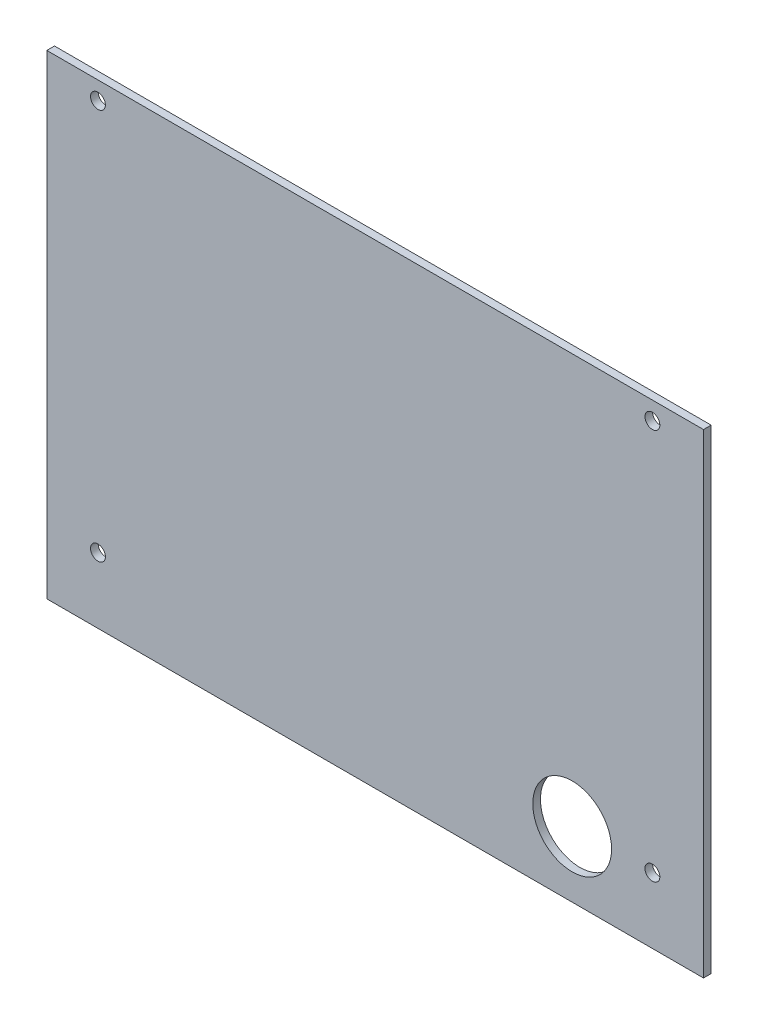
ISO-10303-21;
HEADER;
FILE_DESCRIPTION(('STEP AP214'),'2;1');
FILE_NAME('part.step','',(''),(''),'','','');
FILE_SCHEMA(('AUTOMOTIVE_DESIGN { 1 0 10303 214 1 1 1 1 }'));
ENDSEC;
DATA;
#1=APPLICATION_CONTEXT('core data for automotive mechanical design processes');
#2=APPLICATION_PROTOCOL_DEFINITION('international standard','automotive_design',2000,#1);
#3=PRODUCT_CONTEXT('',#1,'mechanical');
#4=PRODUCT('Part','Part','',(#3));
#5=PRODUCT_RELATED_PRODUCT_CATEGORY('part','',(#4));
#6=PRODUCT_DEFINITION_FORMATION('','',#4);
#7=PRODUCT_DEFINITION_CONTEXT('part definition',#1,'design');
#8=PRODUCT_DEFINITION('design','',#6,#7);
#9=PRODUCT_DEFINITION_SHAPE('','',#8);
#10=(LENGTH_UNIT() NAMED_UNIT(*) SI_UNIT(.MILLI.,.METRE.));
#11=(NAMED_UNIT(*) PLANE_ANGLE_UNIT() SI_UNIT($,.RADIAN.));
#12=(NAMED_UNIT(*) SI_UNIT($,.STERADIAN.) SOLID_ANGLE_UNIT());
#13=UNCERTAINTY_MEASURE_WITH_UNIT(LENGTH_MEASURE(1.E-05),#10,'distance_accuracy_value','');
#14=(GEOMETRIC_REPRESENTATION_CONTEXT(3) GLOBAL_UNCERTAINTY_ASSIGNED_CONTEXT((#13)) GLOBAL_UNIT_ASSIGNED_CONTEXT((#10,
#11,#12)) REPRESENTATION_CONTEXT('',''));
#15=CARTESIAN_POINT('',(0.,0.,0.));
#16=DIRECTION('',(0.,0.,1.));
#17=DIRECTION('',(1.,0.,0.));
#18=AXIS2_PLACEMENT_3D('',#15,#16,#17);
#19=CARTESIAN_POINT('',(75.,101.774140149894,-1.75));
#20=DIRECTION('',(1.,0.,0.));
#21=DIRECTION('',(0.,1.,0.));
#22=AXIS2_PLACEMENT_3D('',#19,#20,#21);
#23=PLANE('',#22);
#24=DIRECTION('',(0.,1.,0.));
#25=VECTOR('',#24,1.);
#26=CARTESIAN_POINT('',(75.,101.774140149894,0.));
#27=LINE('',#26,#25);
#28=CARTESIAN_POINT('',(75.,-6.72585985010618,0.));
#29=VERTEX_POINT('',#28);
#30=CARTESIAN_POINT('',(75.,101.774140149894,0.));
#31=VERTEX_POINT('',#30);
#32=EDGE_CURVE('E104',#29,#31,#27,.T.);
#33=ORIENTED_EDGE('',*,*,#32,.F.);
#34=DIRECTION('',(0.,0.,1.));
#35=VECTOR('',#34,1.);
#36=CARTESIAN_POINT('',(75.,-6.72585985010618,-1.75));
#37=LINE('',#36,#35);
#38=CARTESIAN_POINT('',(75.,-6.72585985010618,-1.75));
#39=VERTEX_POINT('',#38);
#40=EDGE_CURVE('E11',#39,#29,#37,.T.);
#41=ORIENTED_EDGE('',*,*,#40,.F.);
#42=DIRECTION('',(0.,1.,0.));
#43=VECTOR('',#42,1.);
#44=CARTESIAN_POINT('',(75.,101.774140149894,-1.75));
#45=LINE('',#44,#43);
#46=CARTESIAN_POINT('',(75.,101.774140149894,-1.75));
#47=VERTEX_POINT('',#46);
#48=EDGE_CURVE('E97',#39,#47,#45,.T.);
#49=ORIENTED_EDGE('',*,*,#48,.T.);
#50=DIRECTION('',(0.,0.,1.));
#51=VECTOR('',#50,1.);
#52=CARTESIAN_POINT('',(75.,101.774140149894,-1.75));
#53=LINE('',#52,#51);
#54=EDGE_CURVE('E42',#47,#31,#53,.T.);
#55=ORIENTED_EDGE('',*,*,#54,.T.);
#56=EDGE_LOOP('',(#33,#41,#49,#55));
#57=FACE_BOUND('',#56,.T.);
#58=ADVANCED_FACE('F39',(#57),#23,.T.);
#59=CARTESIAN_POINT('',(-75.,-6.72585985010618,-1.75));
#60=DIRECTION('',(0.,-1.,0.));
#61=DIRECTION('',(0.,0.,-1.));
#62=AXIS2_PLACEMENT_3D('',#59,#60,#61);
#63=PLANE('',#62);
#64=DIRECTION('',(1.,0.,0.));
#65=VECTOR('',#64,1.);
#66=CARTESIAN_POINT('',(-75.,-6.72585985010618,0.));
#67=LINE('',#66,#65);
#68=CARTESIAN_POINT('',(-75.,-6.72585985010618,0.));
#69=VERTEX_POINT('',#68);
#70=EDGE_CURVE('E99',#69,#29,#67,.T.);
#71=ORIENTED_EDGE('',*,*,#70,.F.);
#72=DIRECTION('',(0.,0.,1.));
#73=VECTOR('',#72,1.);
#74=CARTESIAN_POINT('',(-75.,-6.72585985010618,-1.75));
#75=LINE('',#74,#73);
#76=CARTESIAN_POINT('',(-75.,-6.72585985010618,-1.75));
#77=VERTEX_POINT('',#76);
#78=EDGE_CURVE('E48',#77,#69,#75,.T.);
#79=ORIENTED_EDGE('',*,*,#78,.F.);
#80=DIRECTION('',(1.,0.,0.));
#81=VECTOR('',#80,1.);
#82=CARTESIAN_POINT('',(-75.,-6.72585985010618,-1.75));
#83=LINE('',#82,#81);
#84=EDGE_CURVE('E94',#77,#39,#83,.T.);
#85=ORIENTED_EDGE('',*,*,#84,.T.);
#86=ORIENTED_EDGE('',*,*,#40,.T.);
#87=EDGE_LOOP('',(#71,#79,#85,#86));
#88=FACE_BOUND('',#87,.T.);
#89=ADVANCED_FACE('F115',(#88),#63,.T.);
#90=CARTESIAN_POINT('',(-75.,101.774140149894,-1.75));
#91=DIRECTION('',(-1.,0.,0.));
#92=DIRECTION('',(0.,-1.,0.));
#93=AXIS2_PLACEMENT_3D('',#90,#91,#92);
#94=PLANE('',#93);
#95=DIRECTION('',(0.,-1.,0.));
#96=VECTOR('',#95,1.);
#97=CARTESIAN_POINT('',(-75.,101.774140149894,0.));
#98=LINE('',#97,#96);
#99=CARTESIAN_POINT('',(-75.,101.774140149894,0.));
#100=VERTEX_POINT('',#99);
#101=EDGE_CURVE('E89',#100,#69,#98,.T.);
#102=ORIENTED_EDGE('',*,*,#101,.F.);
#103=DIRECTION('',(0.,0.,1.));
#104=VECTOR('',#103,1.);
#105=CARTESIAN_POINT('',(-75.,101.774140149894,-1.75));
#106=LINE('',#105,#104);
#107=CARTESIAN_POINT('',(-75.,101.774140149894,-1.75));
#108=VERTEX_POINT('',#107);
#109=EDGE_CURVE('E84',#108,#100,#106,.T.);
#110=ORIENTED_EDGE('',*,*,#109,.F.);
#111=DIRECTION('',(0.,-1.,0.));
#112=VECTOR('',#111,1.);
#113=CARTESIAN_POINT('',(-75.,101.774140149894,-1.75));
#114=LINE('',#113,#112);
#115=EDGE_CURVE('E87',#108,#77,#114,.T.);
#116=ORIENTED_EDGE('',*,*,#115,.T.);
#117=ORIENTED_EDGE('',*,*,#78,.T.);
#118=EDGE_LOOP('',(#102,#110,#116,#117));
#119=FACE_BOUND('',#118,.T.);
#120=ADVANCED_FACE('F86',(#119),#94,.T.);
#121=CARTESIAN_POINT('',(-75.,101.774140149894,-1.75));
#122=DIRECTION('',(0.,1.,0.));
#123=DIRECTION('',(0.,0.,1.));
#124=AXIS2_PLACEMENT_3D('',#121,#122,#123);
#125=PLANE('',#124);
#126=DIRECTION('',(-1.,0.,0.));
#127=VECTOR('',#126,1.);
#128=CARTESIAN_POINT('',(-75.,101.774140149894,0.));
#129=LINE('',#128,#127);
#130=EDGE_CURVE('E107',#31,#100,#129,.T.);
#131=ORIENTED_EDGE('',*,*,#130,.F.);
#132=ORIENTED_EDGE('',*,*,#54,.F.);
#133=DIRECTION('',(-1.,0.,0.));
#134=VECTOR('',#133,1.);
#135=CARTESIAN_POINT('',(-75.,101.774140149894,-1.75));
#136=LINE('',#135,#134);
#137=EDGE_CURVE('E93',#47,#108,#136,.T.);
#138=ORIENTED_EDGE('',*,*,#137,.T.);
#139=ORIENTED_EDGE('',*,*,#109,.T.);
#140=EDGE_LOOP('',(#131,#132,#138,#139));
#141=FACE_BOUND('',#140,.T.);
#142=ADVANCED_FACE('F96',(#141),#125,.T.);
#143=CARTESIAN_POINT('',(0.,0.,-1.75));
#144=DIRECTION('',(0.,0.,1.));
#145=DIRECTION('',(1.,0.,0.));
#146=AXIS2_PLACEMENT_3D('',#143,#144,#145);
#147=PLANE('',#146);
#148=CARTESIAN_POINT('',(-63.325,8.27414014989382,-1.75));
#149=DIRECTION('',(0.,0.,1.));
#150=DIRECTION('',(1.,0.,0.));
#151=AXIS2_PLACEMENT_3D('',#148,#149,#150);
#152=CIRCLE('',#151,1.7);
#153=CARTESIAN_POINT('',(-61.625,8.27414014989382,-1.75));
#154=VERTEX_POINT('',#153);
#155=EDGE_CURVE('E160',#154,#154,#152,.T.);
#156=ORIENTED_EDGE('',*,*,#155,.T.);
#157=EDGE_LOOP('',(#156));
#158=FACE_BOUND('',#157,.T.);
#159=CARTESIAN_POINT('',(-63.325,97.6491401498941,-1.75));
#160=DIRECTION('',(0.,0.,1.));
#161=DIRECTION('',(1.,0.,0.));
#162=AXIS2_PLACEMENT_3D('',#159,#160,#161);
#163=CIRCLE('',#162,1.7);
#164=CARTESIAN_POINT('',(-61.625,97.6491401498941,-1.75));
#165=VERTEX_POINT('',#164);
#166=EDGE_CURVE('E170',#165,#165,#163,.T.);
#167=ORIENTED_EDGE('',*,*,#166,.T.);
#168=EDGE_LOOP('',(#167));
#169=FACE_BOUND('',#168,.T.);
#170=CARTESIAN_POINT('',(63.325,8.27414014989382,-1.75));
#171=DIRECTION('',(0.,0.,1.));
#172=DIRECTION('',(1.,0.,0.));
#173=AXIS2_PLACEMENT_3D('',#170,#171,#172);
#174=CIRCLE('',#173,1.69999999999999);
#175=CARTESIAN_POINT('',(65.025,8.27414014989382,-1.75));
#176=VERTEX_POINT('',#175);
#177=EDGE_CURVE('E176',#176,#176,#174,.T.);
#178=ORIENTED_EDGE('',*,*,#177,.T.);
#179=EDGE_LOOP('',(#178));
#180=FACE_BOUND('',#179,.T.);
#181=CARTESIAN_POINT('',(63.325,97.6491401498941,-1.75));
#182=DIRECTION('',(0.,0.,1.));
#183=DIRECTION('',(1.,0.,0.));
#184=AXIS2_PLACEMENT_3D('',#181,#182,#183);
#185=CIRCLE('',#184,1.69999999999999);
#186=CARTESIAN_POINT('',(65.025,97.6491401498941,-1.75));
#187=VERTEX_POINT('',#186);
#188=EDGE_CURVE('E182',#187,#187,#185,.T.);
#189=ORIENTED_EDGE('',*,*,#188,.T.);
#190=EDGE_LOOP('',(#189));
#191=FACE_BOUND('',#190,.T.);
#192=CARTESIAN_POINT('',(45.,8.27414014989382,-1.75));
#193=DIRECTION('',(0.,0.,1.));
#194=DIRECTION('',(1.,0.,0.));
#195=AXIS2_PLACEMENT_3D('',#192,#193,#194);
#196=CIRCLE('',#195,8.999999999999);
#197=CARTESIAN_POINT('',(53.999999999999,8.27414014989382,-1.75));
#198=VERTEX_POINT('',#197);
#199=EDGE_CURVE('E108',#198,#198,#196,.F.);
#200=ORIENTED_EDGE('',*,*,#199,.F.);
#201=EDGE_LOOP('',(#200));
#202=FACE_BOUND('',#201,.T.);
#203=ORIENTED_EDGE('',*,*,#48,.F.);
#204=ORIENTED_EDGE('',*,*,#84,.F.);
#205=ORIENTED_EDGE('',*,*,#115,.F.);
#206=ORIENTED_EDGE('',*,*,#137,.F.);
#207=EDGE_LOOP('',(#203,#204,#205,#206));
#208=FACE_BOUND('',#207,.T.);
#209=ADVANCED_FACE('F92',(#158,#169,#180,#191,#202,#208),#147,.F.);
#210=CARTESIAN_POINT('',(0.,0.,0.));
#211=DIRECTION('',(0.,0.,1.));
#212=DIRECTION('',(1.,0.,0.));
#213=AXIS2_PLACEMENT_3D('',#210,#211,#212);
#214=PLANE('',#213);
#215=CARTESIAN_POINT('',(-63.325,8.27414014989382,0.));
#216=DIRECTION('',(0.,0.,1.));
#217=DIRECTION('',(1.,0.,0.));
#218=AXIS2_PLACEMENT_3D('',#215,#216,#217);
#219=CIRCLE('',#218,1.7);
#220=CARTESIAN_POINT('',(-61.625,8.27414014989382,0.));
#221=VERTEX_POINT('',#220);
#222=EDGE_CURVE('E163',#221,#221,#219,.T.);
#223=ORIENTED_EDGE('',*,*,#222,.F.);
#224=EDGE_LOOP('',(#223));
#225=FACE_BOUND('',#224,.T.);
#226=CARTESIAN_POINT('',(-63.325,97.6491401498941,0.));
#227=DIRECTION('',(0.,0.,1.));
#228=DIRECTION('',(1.,0.,0.));
#229=AXIS2_PLACEMENT_3D('',#226,#227,#228);
#230=CIRCLE('',#229,1.7);
#231=CARTESIAN_POINT('',(-61.625,97.6491401498941,0.));
#232=VERTEX_POINT('',#231);
#233=EDGE_CURVE('E165',#232,#232,#230,.T.);
#234=ORIENTED_EDGE('',*,*,#233,.F.);
#235=EDGE_LOOP('',(#234));
#236=FACE_BOUND('',#235,.T.);
#237=CARTESIAN_POINT('',(63.325,8.27414014989382,0.));
#238=DIRECTION('',(0.,0.,1.));
#239=DIRECTION('',(1.,0.,0.));
#240=AXIS2_PLACEMENT_3D('',#237,#238,#239);
#241=CIRCLE('',#240,1.69999999999999);
#242=CARTESIAN_POINT('',(65.025,8.27414014989382,0.));
#243=VERTEX_POINT('',#242);
#244=EDGE_CURVE('E173',#243,#243,#241,.T.);
#245=ORIENTED_EDGE('',*,*,#244,.F.);
#246=EDGE_LOOP('',(#245));
#247=FACE_BOUND('',#246,.T.);
#248=CARTESIAN_POINT('',(63.325,97.6491401498941,0.));
#249=DIRECTION('',(0.,0.,1.));
#250=DIRECTION('',(1.,0.,0.));
#251=AXIS2_PLACEMENT_3D('',#248,#249,#250);
#252=CIRCLE('',#251,1.69999999999999);
#253=CARTESIAN_POINT('',(65.025,97.6491401498941,0.));
#254=VERTEX_POINT('',#253);
#255=EDGE_CURVE('E179',#254,#254,#252,.T.);
#256=ORIENTED_EDGE('',*,*,#255,.F.);
#257=EDGE_LOOP('',(#256));
#258=FACE_BOUND('',#257,.T.);
#259=CARTESIAN_POINT('',(45.,8.27414014989382,0.));
#260=DIRECTION('',(0.,0.,1.));
#261=DIRECTION('',(1.,0.,0.));
#262=AXIS2_PLACEMENT_3D('',#259,#260,#261);
#263=CIRCLE('',#262,8.999999999999);
#264=CARTESIAN_POINT('',(53.999999999999,8.27414014989382,0.));
#265=VERTEX_POINT('',#264);
#266=EDGE_CURVE('E185',#265,#265,#263,.T.);
#267=ORIENTED_EDGE('',*,*,#266,.F.);
#268=EDGE_LOOP('',(#267));
#269=FACE_BOUND('',#268,.T.);
#270=ORIENTED_EDGE('',*,*,#32,.T.);
#271=ORIENTED_EDGE('',*,*,#130,.T.);
#272=ORIENTED_EDGE('',*,*,#101,.T.);
#273=ORIENTED_EDGE('',*,*,#70,.T.);
#274=EDGE_LOOP('',(#270,#271,#272,#273));
#275=FACE_BOUND('',#274,.T.);
#276=ADVANCED_FACE('F114',(#225,#236,#247,#258,#269,#275),#214,.T.);
#277=CARTESIAN_POINT('',(45.,8.27414014989382,-1.751));
#278=DIRECTION('',(0.,0.,1.));
#279=DIRECTION('',(1.,0.,0.));
#280=AXIS2_PLACEMENT_3D('',#277,#278,#279);
#281=CYLINDRICAL_SURFACE('',#280,8.999999999999);
#282=CARTESIAN_POINT('',(53.999999999999,8.27414014989382,0.));
#283=CARTESIAN_POINT('',(53.999999999999,8.27414014989382,-0.0182291666666669));
#284=CARTESIAN_POINT('',(53.999999999999,8.27414014989382,-0.0364583333333336));
#285=CARTESIAN_POINT('',(53.999999999999,8.27414014989382,-0.072916666666667));
#286=CARTESIAN_POINT('',(53.999999999999,8.27414014989382,-0.0911458333333336));
#287=CARTESIAN_POINT('',(53.999999999999,8.27414014989382,-0.127604166666667));
#288=CARTESIAN_POINT('',(53.999999999999,8.27414014989382,-0.145833333333334));
#289=CARTESIAN_POINT('',(53.999999999999,8.27414014989382,-0.182291666666667));
#290=CARTESIAN_POINT('',(53.999999999999,8.27414014989382,-0.200520833333334));
#291=CARTESIAN_POINT('',(53.999999999999,8.27414014989382,-0.236979166666667));
#292=CARTESIAN_POINT('',(53.999999999999,8.27414014989382,-0.255208333333334));
#293=CARTESIAN_POINT('',(53.999999999999,8.27414014989382,-0.291666666666667));
#294=CARTESIAN_POINT('',(53.999999999999,8.27414014989382,-0.309895833333334));
#295=CARTESIAN_POINT('',(53.999999999999,8.27414014989382,-0.346354166666667));
#296=CARTESIAN_POINT('',(53.999999999999,8.27414014989382,-0.364583333333334));
#297=CARTESIAN_POINT('',(53.999999999999,8.27414014989382,-0.401041666666667));
#298=CARTESIAN_POINT('',(53.999999999999,8.27414014989382,-0.419270833333333));
#299=CARTESIAN_POINT('',(53.999999999999,8.27414014989382,-0.455729166666667));
#300=CARTESIAN_POINT('',(53.999999999999,8.27414014989382,-0.473958333333334));
#301=CARTESIAN_POINT('',(53.999999999999,8.27414014989382,-0.510416666666667));
#302=CARTESIAN_POINT('',(53.999999999999,8.27414014989382,-0.528645833333334));
#303=CARTESIAN_POINT('',(53.999999999999,8.27414014989382,-0.565104166666667));
#304=CARTESIAN_POINT('',(53.999999999999,8.27414014989382,-0.583333333333334));
#305=CARTESIAN_POINT('',(53.999999999999,8.27414014989382,-0.619791666666667));
#306=CARTESIAN_POINT('',(53.999999999999,8.27414014989382,-0.638020833333334));
#307=CARTESIAN_POINT('',(53.999999999999,8.27414014989382,-0.674479166666667));
#308=CARTESIAN_POINT('',(53.999999999999,8.27414014989382,-0.692708333333334));
#309=CARTESIAN_POINT('',(53.999999999999,8.27414014989382,-0.729166666666667));
#310=CARTESIAN_POINT('',(53.999999999999,8.27414014989382,-0.747395833333333));
#311=CARTESIAN_POINT('',(53.999999999999,8.27414014989382,-0.783854166666667));
#312=CARTESIAN_POINT('',(53.999999999999,8.27414014989382,-0.802083333333333));
#313=CARTESIAN_POINT('',(53.999999999999,8.27414014989382,-0.838541666666667));
#314=CARTESIAN_POINT('',(53.999999999999,8.27414014989382,-0.856770833333333));
#315=CARTESIAN_POINT('',(53.999999999999,8.27414014989382,-0.893229166666667));
#316=CARTESIAN_POINT('',(53.999999999999,8.27414014989382,-0.911458333333333));
#317=CARTESIAN_POINT('',(53.999999999999,8.27414014989382,-0.947916666666667));
#318=CARTESIAN_POINT('',(53.999999999999,8.27414014989382,-0.966145833333333));
#319=CARTESIAN_POINT('',(53.999999999999,8.27414014989382,-1.00260416666667));
#320=CARTESIAN_POINT('',(53.999999999999,8.27414014989382,-1.02083333333333));
#321=CARTESIAN_POINT('',(53.999999999999,8.27414014989382,-1.05729166666667));
#322=CARTESIAN_POINT('',(53.999999999999,8.27414014989382,-1.07552083333333));
#323=CARTESIAN_POINT('',(53.999999999999,8.27414014989382,-1.11197916666667));
#324=CARTESIAN_POINT('',(53.999999999999,8.27414014989382,-1.13020833333333));
#325=CARTESIAN_POINT('',(53.999999999999,8.27414014989382,-1.16666666666667));
#326=CARTESIAN_POINT('',(53.999999999999,8.27414014989382,-1.18489583333333));
#327=CARTESIAN_POINT('',(53.999999999999,8.27414014989382,-1.22135416666667));
#328=CARTESIAN_POINT('',(53.999999999999,8.27414014989382,-1.23958333333333));
#329=CARTESIAN_POINT('',(53.999999999999,8.27414014989382,-1.27604166666667));
#330=CARTESIAN_POINT('',(53.999999999999,8.27414014989382,-1.29427083333333));
#331=CARTESIAN_POINT('',(53.999999999999,8.27414014989382,-1.33072916666667));
#332=CARTESIAN_POINT('',(53.999999999999,8.27414014989382,-1.34895833333333));
#333=CARTESIAN_POINT('',(53.999999999999,8.27414014989382,-1.38541666666667));
#334=CARTESIAN_POINT('',(53.999999999999,8.27414014989382,-1.40364583333333));
#335=CARTESIAN_POINT('',(53.999999999999,8.27414014989382,-1.44010416666667));
#336=CARTESIAN_POINT('',(53.999999999999,8.27414014989382,-1.45833333333333));
#337=CARTESIAN_POINT('',(53.999999999999,8.27414014989382,-1.49479166666667));
#338=CARTESIAN_POINT('',(53.999999999999,8.27414014989382,-1.51302083333333));
#339=CARTESIAN_POINT('',(53.999999999999,8.27414014989382,-1.54947916666667));
#340=CARTESIAN_POINT('',(53.999999999999,8.27414014989382,-1.56770833333333));
#341=CARTESIAN_POINT('',(53.999999999999,8.27414014989382,-1.60416666666667));
#342=CARTESIAN_POINT('',(53.999999999999,8.27414014989382,-1.62239583333333));
#343=CARTESIAN_POINT('',(53.999999999999,8.27414014989382,-1.65885416666667));
#344=CARTESIAN_POINT('',(53.999999999999,8.27414014989382,-1.67708333333333));
#345=CARTESIAN_POINT('',(53.999999999999,8.27414014989382,-1.71354166666667));
#346=CARTESIAN_POINT('',(53.999999999999,8.27414014989382,-1.73177083333333));
#347=CARTESIAN_POINT('',(53.999999999999,8.27414014989382,-1.75));
#348=B_SPLINE_CURVE_WITH_KNOTS('',3,(#282,#283,#284,#285,#286,#287,#288,#289,#290,#291,#292,
#293,#294,#295,#296,#297,#298,#299,#300,#301,#302,#303,#304,#305,#306,#307,#308,#309,#310,#311,
#312,#313,#314,#315,#316,#317,#318,#319,#320,#321,#322,#323,#324,#325,#326,#327,#328,#329,#330,
#331,#332,#333,#334,#335,#336,#337,#338,#339,#340,#341,#342,#343,#344,#345,#346,#347),
.UNSPECIFIED.,.F.,.F.,(4,2,2,2,2,2,2,2,2,2,2,2,2,2,2,2,2,2,2,2,2,2,2,2,2,2,2,2,2,2,2,2,4),(0.,
0.0546875,0.109375,0.1640625,0.21875,0.2734375,0.328125,0.3828125,0.4375,0.4921875,0.546875,
0.6015625,0.65625,0.7109375,0.765625,0.8203125,0.875,0.9296875,0.984375,1.0390625,1.09375,
1.1484375,1.203125,1.2578125,1.3125,1.3671875,1.421875,1.4765625,1.53125,1.5859375,1.640625,
1.6953125,1.75),.UNSPECIFIED.);
#349=EDGE_CURVE('BSEAM133',#265,#198,#348,.T.);
#350=ORIENTED_EDGE('',*,*,#266,.T.);
#351=ORIENTED_EDGE('',*,*,#199,.T.);
#352=ORIENTED_EDGE('',*,*,#349,.T.);
#353=ORIENTED_EDGE('',*,*,#349,.F.);
#354=EDGE_LOOP('',(#350,#352,#351,#353));
#355=FACE_BOUND('',#354,.T.);
#356=ADVANCED_FACE('F133',(#355),#281,.F.);
#357=CARTESIAN_POINT('',(63.325,97.6491401498941,0.));
#358=DIRECTION('',(0.,0.,1.));
#359=DIRECTION('',(1.,0.,0.));
#360=AXIS2_PLACEMENT_3D('',#357,#358,#359);
#361=CYLINDRICAL_SURFACE('',#360,1.69999999999999);
#362=ORIENTED_EDGE('',*,*,#188,.F.);
#363=EDGE_LOOP('',(#362));
#364=FACE_BOUND('',#363,.T.);
#365=ORIENTED_EDGE('',*,*,#255,.T.);
#366=EDGE_LOOP('',(#365));
#367=FACE_BOUND('',#366,.T.);
#368=ADVANCED_FACE('F140',(#364,#367),#361,.F.);
#369=CARTESIAN_POINT('',(63.325,8.27414014989382,0.));
#370=DIRECTION('',(0.,0.,1.));
#371=DIRECTION('',(1.,0.,0.));
#372=AXIS2_PLACEMENT_3D('',#369,#370,#371);
#373=CYLINDRICAL_SURFACE('',#372,1.69999999999999);
#374=ORIENTED_EDGE('',*,*,#177,.F.);
#375=EDGE_LOOP('',(#374));
#376=FACE_BOUND('',#375,.T.);
#377=ORIENTED_EDGE('',*,*,#244,.T.);
#378=EDGE_LOOP('',(#377));
#379=FACE_BOUND('',#378,.T.);
#380=ADVANCED_FACE('F144',(#376,#379),#373,.F.);
#381=CARTESIAN_POINT('',(-63.325,97.6491401498941,0.));
#382=DIRECTION('',(0.,0.,1.));
#383=DIRECTION('',(1.,0.,0.));
#384=AXIS2_PLACEMENT_3D('',#381,#382,#383);
#385=CYLINDRICAL_SURFACE('',#384,1.7);
#386=ORIENTED_EDGE('',*,*,#166,.F.);
#387=EDGE_LOOP('',(#386));
#388=FACE_BOUND('',#387,.T.);
#389=ORIENTED_EDGE('',*,*,#233,.T.);
#390=EDGE_LOOP('',(#389));
#391=FACE_BOUND('',#390,.T.);
#392=ADVANCED_FACE('F148',(#388,#391),#385,.F.);
#393=CARTESIAN_POINT('',(-63.325,8.27414014989382,0.));
#394=DIRECTION('',(0.,0.,1.));
#395=DIRECTION('',(1.,0.,0.));
#396=AXIS2_PLACEMENT_3D('',#393,#394,#395);
#397=CYLINDRICAL_SURFACE('',#396,1.7);
#398=ORIENTED_EDGE('',*,*,#155,.F.);
#399=EDGE_LOOP('',(#398));
#400=FACE_BOUND('',#399,.T.);
#401=ORIENTED_EDGE('',*,*,#222,.T.);
#402=EDGE_LOOP('',(#401));
#403=FACE_BOUND('',#402,.T.);
#404=ADVANCED_FACE('F152',(#400,#403),#397,.F.);
#405=CLOSED_SHELL('',(#58,#89,#120,#142,#209,#276,#356,#368,#380,#392,#404));
#406=MANIFOLD_SOLID_BREP('B2',#405);
#407=ADVANCED_BREP_SHAPE_REPRESENTATION('',(#18,#406),#14);
#408=SHAPE_DEFINITION_REPRESENTATION(#9,#407);
ENDSEC;
END-ISO-10303-21;
